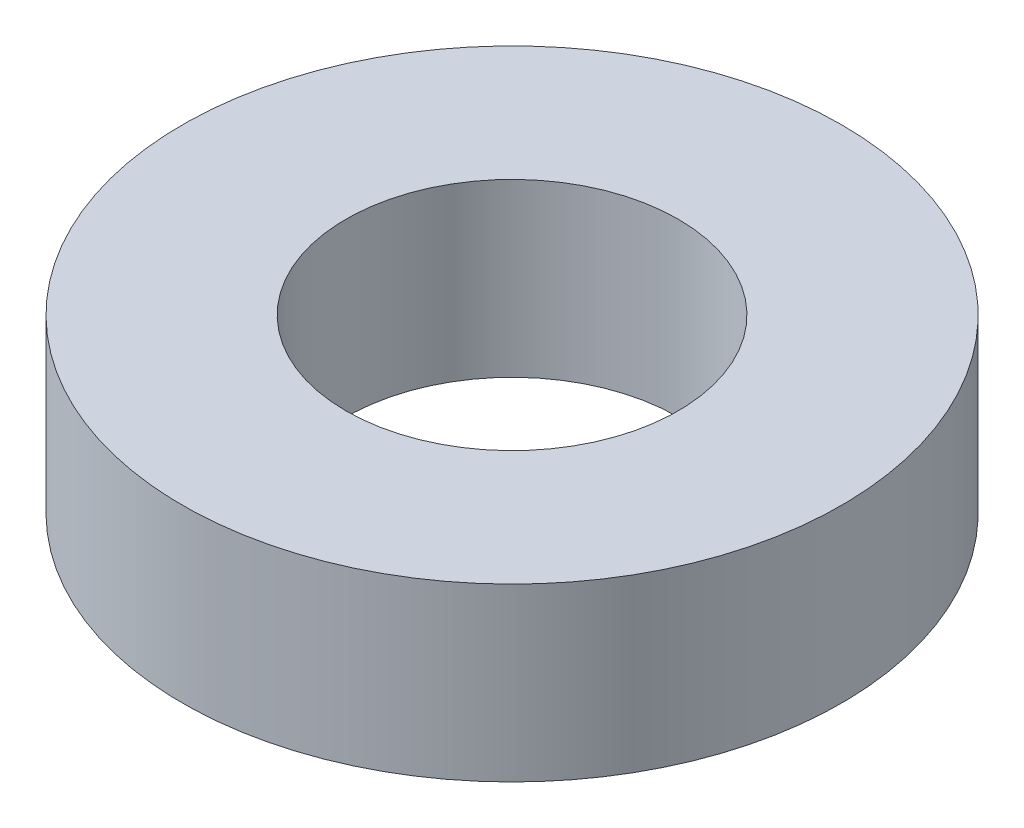
ISO-10303-21;
HEADER;
FILE_DESCRIPTION(('STEP AP214'),'2;1');
FILE_NAME('part.step','',(''),(''),'','','');
FILE_SCHEMA(('AUTOMOTIVE_DESIGN { 1 0 10303 214 1 1 1 1 }'));
ENDSEC;
DATA;
#1=APPLICATION_CONTEXT('core data for automotive mechanical design processes');
#2=APPLICATION_PROTOCOL_DEFINITION('international standard','automotive_design',2000,#1);
#3=PRODUCT_CONTEXT('',#1,'mechanical');
#4=PRODUCT('Part','Part','',(#3));
#5=PRODUCT_RELATED_PRODUCT_CATEGORY('part','',(#4));
#6=PRODUCT_DEFINITION_FORMATION('','',#4);
#7=PRODUCT_DEFINITION_CONTEXT('part definition',#1,'design');
#8=PRODUCT_DEFINITION('design','',#6,#7);
#9=PRODUCT_DEFINITION_SHAPE('','',#8);
#10=(LENGTH_UNIT() NAMED_UNIT(*) SI_UNIT(.MILLI.,.METRE.));
#11=(NAMED_UNIT(*) PLANE_ANGLE_UNIT() SI_UNIT($,.RADIAN.));
#12=(NAMED_UNIT(*) SI_UNIT($,.STERADIAN.) SOLID_ANGLE_UNIT());
#13=UNCERTAINTY_MEASURE_WITH_UNIT(LENGTH_MEASURE(1.E-05),#10,'distance_accuracy_value','');
#14=(GEOMETRIC_REPRESENTATION_CONTEXT(3) GLOBAL_UNCERTAINTY_ASSIGNED_CONTEXT((#13)) GLOBAL_UNIT_ASSIGNED_CONTEXT((#10,
#11,#12)) REPRESENTATION_CONTEXT('',''));
#15=CARTESIAN_POINT('',(0.,0.,0.));
#16=DIRECTION('',(0.,0.,1.));
#17=DIRECTION('',(1.,0.,0.));
#18=AXIS2_PLACEMENT_3D('',#15,#16,#17);
#19=CARTESIAN_POINT('',(0.,3.302,0.));
#20=DIRECTION('',(0.,1.,0.));
#21=DIRECTION('',(0.,0.,1.));
#22=AXIS2_PLACEMENT_3D('',#19,#20,#21);
#23=PLANE('',#22);
#24=CARTESIAN_POINT('',(0.,3.302,0.));
#25=DIRECTION('',(0.,1.,0.));
#26=DIRECTION('',(0.,0.,1.));
#27=AXIS2_PLACEMENT_3D('',#24,#25,#26);
#28=CIRCLE('',#27,6.35);
#29=CARTESIAN_POINT('',(0.,3.302,-6.35));
#30=VERTEX_POINT('',#29);
#31=EDGE_CURVE('E10',#30,#30,#28,.T.);
#32=ORIENTED_EDGE('',*,*,#31,.T.);
#33=EDGE_LOOP('',(#32));
#34=FACE_BOUND('',#33,.T.);
#35=CARTESIAN_POINT('',(0.,3.302,0.));
#36=DIRECTION('',(0.,1.,0.));
#37=DIRECTION('',(0.,0.,1.));
#38=AXIS2_PLACEMENT_3D('',#35,#36,#37);
#39=CIRCLE('',#38,3.2004);
#40=CARTESIAN_POINT('',(0.,3.302,-3.2004));
#41=VERTEX_POINT('',#40);
#42=EDGE_CURVE('E41',#41,#41,#39,.T.);
#43=ORIENTED_EDGE('',*,*,#42,.F.);
#44=EDGE_LOOP('',(#43));
#45=FACE_BOUND('',#44,.T.);
#46=ADVANCED_FACE('F30',(#34,#45),#23,.T.);
#47=CARTESIAN_POINT('',(0.,0.,0.));
#48=DIRECTION('',(0.,1.,0.));
#49=DIRECTION('',(0.,0.,1.));
#50=AXIS2_PLACEMENT_3D('',#47,#48,#49);
#51=PLANE('',#50);
#52=CARTESIAN_POINT('',(0.,0.,0.));
#53=DIRECTION('',(0.,1.,0.));
#54=DIRECTION('',(0.,0.,1.));
#55=AXIS2_PLACEMENT_3D('',#52,#53,#54);
#56=CIRCLE('',#55,6.35);
#57=CARTESIAN_POINT('',(0.,0.,-6.35));
#58=VERTEX_POINT('',#57);
#59=EDGE_CURVE('E34',#58,#58,#56,.T.);
#60=ORIENTED_EDGE('',*,*,#59,.F.);
#61=EDGE_LOOP('',(#60));
#62=FACE_BOUND('',#61,.T.);
#63=CARTESIAN_POINT('',(0.,0.,0.));
#64=DIRECTION('',(0.,1.,0.));
#65=DIRECTION('',(0.,0.,1.));
#66=AXIS2_PLACEMENT_3D('',#63,#64,#65);
#67=CIRCLE('',#66,3.2004);
#68=CARTESIAN_POINT('',(0.,0.,-3.2004));
#69=VERTEX_POINT('',#68);
#70=EDGE_CURVE('E43',#69,#69,#67,.T.);
#71=ORIENTED_EDGE('',*,*,#70,.T.);
#72=EDGE_LOOP('',(#71));
#73=FACE_BOUND('',#72,.T.);
#74=ADVANCED_FACE('F53',(#62,#73),#51,.F.);
#75=CARTESIAN_POINT('',(0.,3.302,0.));
#76=DIRECTION('',(0.,-1.,0.));
#77=DIRECTION('',(0.,0.,-1.));
#78=AXIS2_PLACEMENT_3D('',#75,#76,#77);
#79=CYLINDRICAL_SURFACE('',#78,6.35);
#80=CARTESIAN_POINT('',(0.,3.302,-6.35));
#81=CARTESIAN_POINT('',(0.,3.26760416666667,-6.35));
#82=CARTESIAN_POINT('',(0.,3.23320833333333,-6.35));
#83=CARTESIAN_POINT('',(0.,3.16441666666667,-6.35));
#84=CARTESIAN_POINT('',(0.,3.13002083333333,-6.35));
#85=CARTESIAN_POINT('',(0.,3.06122916666667,-6.35));
#86=CARTESIAN_POINT('',(0.,3.02683333333333,-6.35));
#87=CARTESIAN_POINT('',(0.,2.95804166666667,-6.35));
#88=CARTESIAN_POINT('',(0.,2.92364583333333,-6.35));
#89=CARTESIAN_POINT('',(0.,2.85485416666667,-6.35));
#90=CARTESIAN_POINT('',(0.,2.82045833333333,-6.35));
#91=CARTESIAN_POINT('',(0.,2.75166666666667,-6.35));
#92=CARTESIAN_POINT('',(0.,2.71727083333333,-6.35));
#93=CARTESIAN_POINT('',(0.,2.64847916666667,-6.35));
#94=CARTESIAN_POINT('',(0.,2.61408333333333,-6.35));
#95=CARTESIAN_POINT('',(0.,2.54529166666667,-6.35));
#96=CARTESIAN_POINT('',(0.,2.51089583333333,-6.35));
#97=CARTESIAN_POINT('',(0.,2.44210416666667,-6.35));
#98=CARTESIAN_POINT('',(0.,2.40770833333333,-6.35));
#99=CARTESIAN_POINT('',(0.,2.33891666666667,-6.35));
#100=CARTESIAN_POINT('',(0.,2.30452083333333,-6.35));
#101=CARTESIAN_POINT('',(0.,2.23572916666667,-6.35));
#102=CARTESIAN_POINT('',(0.,2.20133333333333,-6.35));
#103=CARTESIAN_POINT('',(0.,2.13254166666667,-6.35));
#104=CARTESIAN_POINT('',(0.,2.09814583333333,-6.35));
#105=CARTESIAN_POINT('',(0.,2.02935416666667,-6.35));
#106=CARTESIAN_POINT('',(0.,1.99495833333333,-6.35));
#107=CARTESIAN_POINT('',(0.,1.92616666666667,-6.35));
#108=CARTESIAN_POINT('',(0.,1.89177083333333,-6.35));
#109=CARTESIAN_POINT('',(0.,1.82297916666667,-6.35));
#110=CARTESIAN_POINT('',(0.,1.78858333333333,-6.35));
#111=CARTESIAN_POINT('',(0.,1.71979166666667,-6.35));
#112=CARTESIAN_POINT('',(0.,1.68539583333333,-6.35));
#113=CARTESIAN_POINT('',(0.,1.61660416666667,-6.35));
#114=CARTESIAN_POINT('',(0.,1.58220833333333,-6.35));
#115=CARTESIAN_POINT('',(0.,1.51341666666667,-6.35));
#116=CARTESIAN_POINT('',(0.,1.47902083333333,-6.35));
#117=CARTESIAN_POINT('',(0.,1.41022916666667,-6.35));
#118=CARTESIAN_POINT('',(0.,1.37583333333333,-6.35));
#119=CARTESIAN_POINT('',(0.,1.30704166666667,-6.35));
#120=CARTESIAN_POINT('',(0.,1.27264583333333,-6.35));
#121=CARTESIAN_POINT('',(0.,1.20385416666667,-6.35));
#122=CARTESIAN_POINT('',(0.,1.16945833333333,-6.35));
#123=CARTESIAN_POINT('',(0.,1.10066666666667,-6.35));
#124=CARTESIAN_POINT('',(0.,1.06627083333333,-6.35));
#125=CARTESIAN_POINT('',(0.,0.997479166666666,-6.35));
#126=CARTESIAN_POINT('',(0.,0.963083333333333,-6.35));
#127=CARTESIAN_POINT('',(0.,0.894291666666666,-6.35));
#128=CARTESIAN_POINT('',(0.,0.859895833333333,-6.35));
#129=CARTESIAN_POINT('',(0.,0.791104166666666,-6.35));
#130=CARTESIAN_POINT('',(0.,0.756708333333333,-6.35));
#131=CARTESIAN_POINT('',(0.,0.687916666666667,-6.35));
#132=CARTESIAN_POINT('',(0.,0.653520833333333,-6.35));
#133=CARTESIAN_POINT('',(0.,0.584729166666667,-6.35));
#134=CARTESIAN_POINT('',(0.,0.550333333333333,-6.35));
#135=CARTESIAN_POINT('',(0.,0.481541666666667,-6.35));
#136=CARTESIAN_POINT('',(0.,0.447145833333333,-6.35));
#137=CARTESIAN_POINT('',(0.,0.378354166666667,-6.35));
#138=CARTESIAN_POINT('',(0.,0.343958333333333,-6.35));
#139=CARTESIAN_POINT('',(0.,0.275166666666667,-6.35));
#140=CARTESIAN_POINT('',(0.,0.240770833333333,-6.35));
#141=CARTESIAN_POINT('',(0.,0.171979166666667,-6.35));
#142=CARTESIAN_POINT('',(0.,0.137583333333333,-6.35));
#143=CARTESIAN_POINT('',(0.,0.0687916666666666,-6.35));
#144=CARTESIAN_POINT('',(0.,0.0343958333333333,-6.35));
#145=CARTESIAN_POINT('',(0.,0.,-6.35));
#146=B_SPLINE_CURVE_WITH_KNOTS('',3,(#80,#81,#82,#83,#84,#85,#86,#87,#88,#89,#90,#91,#92,#93,
#94,#95,#96,#97,#98,#99,#100,#101,#102,#103,#104,#105,#106,#107,#108,#109,#110,#111,#112,#113,
#114,#115,#116,#117,#118,#119,#120,#121,#122,#123,#124,#125,#126,#127,#128,#129,#130,#131,#132,
#133,#134,#135,#136,#137,#138,#139,#140,#141,#142,#143,#144,#145),.UNSPECIFIED.,.F.,.F.,(4,2,2,
2,2,2,2,2,2,2,2,2,2,2,2,2,2,2,2,2,2,2,2,2,2,2,2,2,2,2,2,2,4),(0.,0.1031875,0.206375,0.3095625,
0.41275,0.5159375,0.619125,0.7223125,0.8255,0.9286875,1.031875,1.1350625,1.23825,1.3414375,
1.444625,1.5478125,1.651,1.7541875,1.857375,1.9605625,2.06375,2.1669375,2.270125,2.3733125,
2.4765,2.5796875,2.682875,2.7860625,2.88925,2.9924375,3.095625,3.1988125,3.302),.UNSPECIFIED.);
#147=EDGE_CURVE('BSEAM32',#30,#58,#146,.T.);
#148=ORIENTED_EDGE('',*,*,#31,.F.);
#149=ORIENTED_EDGE('',*,*,#59,.T.);
#150=ORIENTED_EDGE('',*,*,#147,.T.);
#151=ORIENTED_EDGE('',*,*,#147,.F.);
#152=EDGE_LOOP('',(#148,#150,#149,#151));
#153=FACE_BOUND('',#152,.T.);
#154=ADVANCED_FACE('F32',(#153),#79,.T.);
#155=CARTESIAN_POINT('',(0.,3.302,0.));
#156=DIRECTION('',(0.,-1.,0.));
#157=DIRECTION('',(0.,0.,-1.));
#158=AXIS2_PLACEMENT_3D('',#155,#156,#157);
#159=CYLINDRICAL_SURFACE('',#158,3.2004);
#160=CARTESIAN_POINT('',(0.,3.302,-3.2004));
#161=CARTESIAN_POINT('',(0.,3.26760416666667,-3.2004));
#162=CARTESIAN_POINT('',(0.,3.23320833333333,-3.2004));
#163=CARTESIAN_POINT('',(0.,3.16441666666667,-3.2004));
#164=CARTESIAN_POINT('',(0.,3.13002083333333,-3.2004));
#165=CARTESIAN_POINT('',(0.,3.06122916666667,-3.2004));
#166=CARTESIAN_POINT('',(0.,3.02683333333333,-3.2004));
#167=CARTESIAN_POINT('',(0.,2.95804166666667,-3.2004));
#168=CARTESIAN_POINT('',(0.,2.92364583333333,-3.2004));
#169=CARTESIAN_POINT('',(0.,2.85485416666667,-3.2004));
#170=CARTESIAN_POINT('',(0.,2.82045833333333,-3.2004));
#171=CARTESIAN_POINT('',(0.,2.75166666666667,-3.2004));
#172=CARTESIAN_POINT('',(0.,2.71727083333333,-3.2004));
#173=CARTESIAN_POINT('',(0.,2.64847916666667,-3.2004));
#174=CARTESIAN_POINT('',(0.,2.61408333333333,-3.2004));
#175=CARTESIAN_POINT('',(0.,2.54529166666667,-3.2004));
#176=CARTESIAN_POINT('',(0.,2.51089583333333,-3.2004));
#177=CARTESIAN_POINT('',(0.,2.44210416666667,-3.2004));
#178=CARTESIAN_POINT('',(0.,2.40770833333333,-3.2004));
#179=CARTESIAN_POINT('',(0.,2.33891666666667,-3.2004));
#180=CARTESIAN_POINT('',(0.,2.30452083333333,-3.2004));
#181=CARTESIAN_POINT('',(0.,2.23572916666667,-3.2004));
#182=CARTESIAN_POINT('',(0.,2.20133333333333,-3.2004));
#183=CARTESIAN_POINT('',(0.,2.13254166666667,-3.2004));
#184=CARTESIAN_POINT('',(0.,2.09814583333333,-3.2004));
#185=CARTESIAN_POINT('',(0.,2.02935416666667,-3.2004));
#186=CARTESIAN_POINT('',(0.,1.99495833333333,-3.2004));
#187=CARTESIAN_POINT('',(0.,1.92616666666667,-3.2004));
#188=CARTESIAN_POINT('',(0.,1.89177083333333,-3.2004));
#189=CARTESIAN_POINT('',(0.,1.82297916666667,-3.2004));
#190=CARTESIAN_POINT('',(0.,1.78858333333333,-3.2004));
#191=CARTESIAN_POINT('',(0.,1.71979166666667,-3.2004));
#192=CARTESIAN_POINT('',(0.,1.68539583333333,-3.2004));
#193=CARTESIAN_POINT('',(0.,1.61660416666667,-3.2004));
#194=CARTESIAN_POINT('',(0.,1.58220833333333,-3.2004));
#195=CARTESIAN_POINT('',(0.,1.51341666666667,-3.2004));
#196=CARTESIAN_POINT('',(0.,1.47902083333333,-3.2004));
#197=CARTESIAN_POINT('',(0.,1.41022916666667,-3.2004));
#198=CARTESIAN_POINT('',(0.,1.37583333333333,-3.2004));
#199=CARTESIAN_POINT('',(0.,1.30704166666667,-3.2004));
#200=CARTESIAN_POINT('',(0.,1.27264583333333,-3.2004));
#201=CARTESIAN_POINT('',(0.,1.20385416666667,-3.2004));
#202=CARTESIAN_POINT('',(0.,1.16945833333333,-3.2004));
#203=CARTESIAN_POINT('',(0.,1.10066666666667,-3.2004));
#204=CARTESIAN_POINT('',(0.,1.06627083333333,-3.2004));
#205=CARTESIAN_POINT('',(0.,0.997479166666667,-3.2004));
#206=CARTESIAN_POINT('',(0.,0.963083333333334,-3.2004));
#207=CARTESIAN_POINT('',(0.,0.894291666666667,-3.2004));
#208=CARTESIAN_POINT('',(0.,0.859895833333333,-3.2004));
#209=CARTESIAN_POINT('',(0.,0.791104166666666,-3.2004));
#210=CARTESIAN_POINT('',(0.,0.756708333333333,-3.2004));
#211=CARTESIAN_POINT('',(0.,0.687916666666667,-3.2004));
#212=CARTESIAN_POINT('',(0.,0.653520833333333,-3.2004));
#213=CARTESIAN_POINT('',(0.,0.584729166666667,-3.2004));
#214=CARTESIAN_POINT('',(0.,0.550333333333333,-3.2004));
#215=CARTESIAN_POINT('',(0.,0.481541666666667,-3.2004));
#216=CARTESIAN_POINT('',(0.,0.447145833333333,-3.2004));
#217=CARTESIAN_POINT('',(0.,0.378354166666667,-3.2004));
#218=CARTESIAN_POINT('',(0.,0.343958333333333,-3.2004));
#219=CARTESIAN_POINT('',(0.,0.275166666666667,-3.2004));
#220=CARTESIAN_POINT('',(0.,0.240770833333333,-3.2004));
#221=CARTESIAN_POINT('',(0.,0.171979166666667,-3.2004));
#222=CARTESIAN_POINT('',(0.,0.137583333333333,-3.2004));
#223=CARTESIAN_POINT('',(0.,0.0687916666666666,-3.2004));
#224=CARTESIAN_POINT('',(0.,0.0343958333333333,-3.2004));
#225=CARTESIAN_POINT('',(0.,0.,-3.2004));
#226=B_SPLINE_CURVE_WITH_KNOTS('',3,(#160,#161,#162,#163,#164,#165,#166,#167,#168,#169,#170,
#171,#172,#173,#174,#175,#176,#177,#178,#179,#180,#181,#182,#183,#184,#185,#186,#187,#188,#189,
#190,#191,#192,#193,#194,#195,#196,#197,#198,#199,#200,#201,#202,#203,#204,#205,#206,#207,#208,
#209,#210,#211,#212,#213,#214,#215,#216,#217,#218,#219,#220,#221,#222,#223,#224,#225),
.UNSPECIFIED.,.F.,.F.,(4,2,2,2,2,2,2,2,2,2,2,2,2,2,2,2,2,2,2,2,2,2,2,2,2,2,2,2,2,2,2,2,4),(0.,
0.1031875,0.206375,0.3095625,0.41275,0.5159375,0.619125,0.7223125,0.8255,0.9286875,1.031875,
1.1350625,1.23825,1.3414375,1.444625,1.5478125,1.651,1.7541875,1.857375,1.9605625,2.06375,
2.1669375,2.270125,2.3733125,2.4765,2.5796875,2.682875,2.7860625,2.88925,2.9924375,3.095625,
3.1988125,3.302),.UNSPECIFIED.);
#227=EDGE_CURVE('BSEAM49',#41,#69,#226,.T.);
#228=ORIENTED_EDGE('',*,*,#42,.T.);
#229=ORIENTED_EDGE('',*,*,#70,.F.);
#230=ORIENTED_EDGE('',*,*,#227,.T.);
#231=ORIENTED_EDGE('',*,*,#227,.F.);
#232=EDGE_LOOP('',(#228,#230,#229,#231));
#233=FACE_BOUND('',#232,.T.);
#234=ADVANCED_FACE('F49',(#233),#159,.F.);
#235=CLOSED_SHELL('',(#46,#74,#154,#234));
#236=MANIFOLD_SOLID_BREP('B2',#235);
#237=ADVANCED_BREP_SHAPE_REPRESENTATION('',(#18,#236),#14);
#238=SHAPE_DEFINITION_REPRESENTATION(#9,#237);
ENDSEC;
END-ISO-10303-21;
